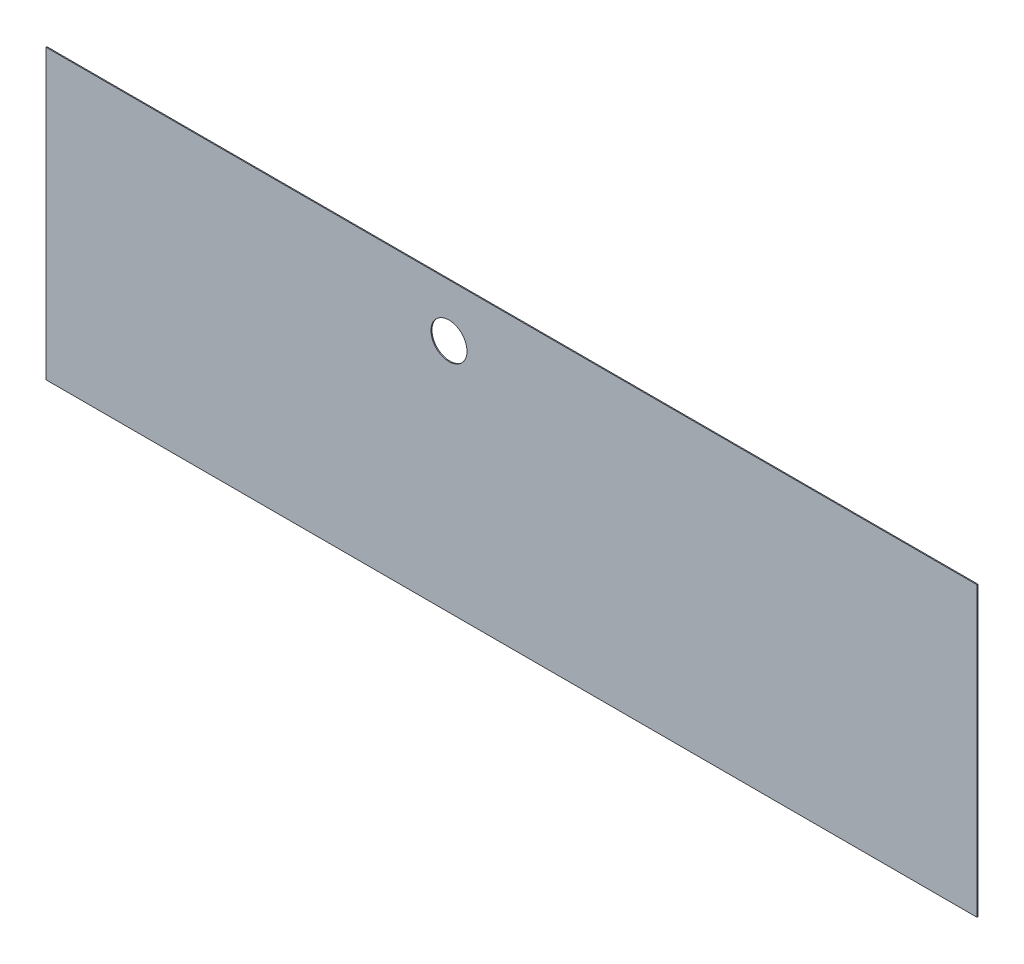
ISO-10303-21;
HEADER;
FILE_DESCRIPTION(('STEP AP214'),'2;1');
FILE_NAME('part.step','',(''),(''),'','','');
FILE_SCHEMA(('AUTOMOTIVE_DESIGN { 1 0 10303 214 1 1 1 1 }'));
ENDSEC;
DATA;
#1=APPLICATION_CONTEXT('core data for automotive mechanical design processes');
#2=APPLICATION_PROTOCOL_DEFINITION('international standard','automotive_design',2000,#1);
#3=PRODUCT_CONTEXT('',#1,'mechanical');
#4=PRODUCT('Part','Part','',(#3));
#5=PRODUCT_RELATED_PRODUCT_CATEGORY('part','',(#4));
#6=PRODUCT_DEFINITION_FORMATION('','',#4);
#7=PRODUCT_DEFINITION_CONTEXT('part definition',#1,'design');
#8=PRODUCT_DEFINITION('design','',#6,#7);
#9=PRODUCT_DEFINITION_SHAPE('','',#8);
#10=(LENGTH_UNIT() NAMED_UNIT(*) SI_UNIT(.MILLI.,.METRE.));
#11=(NAMED_UNIT(*) PLANE_ANGLE_UNIT() SI_UNIT($,.RADIAN.));
#12=(NAMED_UNIT(*) SI_UNIT($,.STERADIAN.) SOLID_ANGLE_UNIT());
#13=UNCERTAINTY_MEASURE_WITH_UNIT(LENGTH_MEASURE(1.E-05),#10,'distance_accuracy_value','');
#14=(GEOMETRIC_REPRESENTATION_CONTEXT(3) GLOBAL_UNCERTAINTY_ASSIGNED_CONTEXT((#13)) GLOBAL_UNIT_ASSIGNED_CONTEXT((#10,
#11,#12)) REPRESENTATION_CONTEXT('',''));
#15=CARTESIAN_POINT('',(0.,0.,0.));
#16=DIRECTION('',(0.,0.,1.));
#17=DIRECTION('',(1.,0.,0.));
#18=AXIS2_PLACEMENT_3D('',#15,#16,#17);
#19=CARTESIAN_POINT('',(-969.75,-300.,2.));
#20=DIRECTION('',(1.,0.,0.));
#21=DIRECTION('',(0.,0.,-1.));
#22=AXIS2_PLACEMENT_3D('',#19,#20,#21);
#23=PLANE('',#22);
#24=DIRECTION('',(0.,-1.,0.));
#25=VECTOR('',#24,1.);
#26=CARTESIAN_POINT('',(-969.75,-300.,0.));
#27=LINE('',#26,#25);
#28=CARTESIAN_POINT('',(-969.75,300.,0.));
#29=VERTEX_POINT('',#28);
#30=CARTESIAN_POINT('',(-969.75,-300.,0.));
#31=VERTEX_POINT('',#30);
#32=EDGE_CURVE('E94',#29,#31,#27,.T.);
#33=ORIENTED_EDGE('',*,*,#32,.T.);
#34=DIRECTION('',(0.,0.,-1.));
#35=VECTOR('',#34,1.);
#36=CARTESIAN_POINT('',(-969.75,-300.,2.));
#37=LINE('',#36,#35);
#38=CARTESIAN_POINT('',(-969.75,-300.,2.));
#39=VERTEX_POINT('',#38);
#40=EDGE_CURVE('E11',#39,#31,#37,.T.);
#41=ORIENTED_EDGE('',*,*,#40,.F.);
#42=DIRECTION('',(0.,-1.,0.));
#43=VECTOR('',#42,1.);
#44=CARTESIAN_POINT('',(-969.75,-300.,2.));
#45=LINE('',#44,#43);
#46=CARTESIAN_POINT('',(-969.75,300.,2.));
#47=VERTEX_POINT('',#46);
#48=EDGE_CURVE('E82',#47,#39,#45,.T.);
#49=ORIENTED_EDGE('',*,*,#48,.F.);
#50=DIRECTION('',(0.,0.,-1.));
#51=VECTOR('',#50,1.);
#52=CARTESIAN_POINT('',(-969.75,300.,2.));
#53=LINE('',#52,#51);
#54=EDGE_CURVE('E90',#47,#29,#53,.T.);
#55=ORIENTED_EDGE('',*,*,#54,.T.);
#56=EDGE_LOOP('',(#33,#41,#49,#55));
#57=FACE_BOUND('',#56,.T.);
#58=ADVANCED_FACE('F31',(#57),#23,.F.);
#59=CARTESIAN_POINT('',(969.75,-300.,2.));
#60=DIRECTION('',(0.,1.,0.));
#61=DIRECTION('',(-1.,0.,0.));
#62=AXIS2_PLACEMENT_3D('',#59,#60,#61);
#63=PLANE('',#62);
#64=DIRECTION('',(1.,0.,0.));
#65=VECTOR('',#64,1.);
#66=CARTESIAN_POINT('',(969.75,-300.,0.));
#67=LINE('',#66,#65);
#68=CARTESIAN_POINT('',(969.75,-300.,0.));
#69=VERTEX_POINT('',#68);
#70=EDGE_CURVE('E86',#31,#69,#67,.T.);
#71=ORIENTED_EDGE('',*,*,#70,.T.);
#72=DIRECTION('',(0.,0.,-1.));
#73=VECTOR('',#72,1.);
#74=CARTESIAN_POINT('',(969.75,-300.,2.));
#75=LINE('',#74,#73);
#76=CARTESIAN_POINT('',(969.75,-300.,2.));
#77=VERTEX_POINT('',#76);
#78=EDGE_CURVE('E39',#77,#69,#75,.T.);
#79=ORIENTED_EDGE('',*,*,#78,.F.);
#80=DIRECTION('',(1.,0.,0.));
#81=VECTOR('',#80,1.);
#82=CARTESIAN_POINT('',(969.75,-300.,2.));
#83=LINE('',#82,#81);
#84=EDGE_CURVE('E77',#39,#77,#83,.T.);
#85=ORIENTED_EDGE('',*,*,#84,.F.);
#86=ORIENTED_EDGE('',*,*,#40,.T.);
#87=EDGE_LOOP('',(#71,#79,#85,#86));
#88=FACE_BOUND('',#87,.T.);
#89=ADVANCED_FACE('F85',(#88),#63,.F.);
#90=CARTESIAN_POINT('',(969.75,-300.,2.));
#91=DIRECTION('',(-1.,0.,0.));
#92=DIRECTION('',(0.,0.,1.));
#93=AXIS2_PLACEMENT_3D('',#90,#91,#92);
#94=PLANE('',#93);
#95=DIRECTION('',(0.,1.,0.));
#96=VECTOR('',#95,1.);
#97=CARTESIAN_POINT('',(969.75,-300.,0.));
#98=LINE('',#97,#96);
#99=CARTESIAN_POINT('',(969.75,300.,0.));
#100=VERTEX_POINT('',#99);
#101=EDGE_CURVE('E64',#69,#100,#98,.T.);
#102=ORIENTED_EDGE('',*,*,#101,.T.);
#103=DIRECTION('',(0.,0.,-1.));
#104=VECTOR('',#103,1.);
#105=CARTESIAN_POINT('',(969.75,300.,2.));
#106=LINE('',#105,#104);
#107=CARTESIAN_POINT('',(969.75,300.,2.));
#108=VERTEX_POINT('',#107);
#109=EDGE_CURVE('E87',#108,#100,#106,.T.);
#110=ORIENTED_EDGE('',*,*,#109,.F.);
#111=DIRECTION('',(0.,1.,0.));
#112=VECTOR('',#111,1.);
#113=CARTESIAN_POINT('',(969.75,-300.,2.));
#114=LINE('',#113,#112);
#115=EDGE_CURVE('E80',#77,#108,#114,.T.);
#116=ORIENTED_EDGE('',*,*,#115,.F.);
#117=ORIENTED_EDGE('',*,*,#78,.T.);
#118=EDGE_LOOP('',(#102,#110,#116,#117));
#119=FACE_BOUND('',#118,.T.);
#120=ADVANCED_FACE('F88',(#119),#94,.F.);
#121=CARTESIAN_POINT('',(969.75,300.,2.));
#122=DIRECTION('',(0.,-1.,0.));
#123=DIRECTION('',(1.,0.,0.));
#124=AXIS2_PLACEMENT_3D('',#121,#122,#123);
#125=PLANE('',#124);
#126=DIRECTION('',(-1.,0.,0.));
#127=VECTOR('',#126,1.);
#128=CARTESIAN_POINT('',(969.75,300.,0.));
#129=LINE('',#128,#127);
#130=EDGE_CURVE('E70',#100,#29,#129,.T.);
#131=ORIENTED_EDGE('',*,*,#130,.T.);
#132=ORIENTED_EDGE('',*,*,#54,.F.);
#133=DIRECTION('',(-1.,0.,0.));
#134=VECTOR('',#133,1.);
#135=CARTESIAN_POINT('',(969.75,300.,2.));
#136=LINE('',#135,#134);
#137=EDGE_CURVE('E47',#108,#47,#136,.T.);
#138=ORIENTED_EDGE('',*,*,#137,.F.);
#139=ORIENTED_EDGE('',*,*,#109,.T.);
#140=EDGE_LOOP('',(#131,#132,#138,#139));
#141=FACE_BOUND('',#140,.T.);
#142=ADVANCED_FACE('F102',(#141),#125,.F.);
#143=CARTESIAN_POINT('',(-969.75,300.,2.));
#144=DIRECTION('',(0.,0.,1.));
#145=DIRECTION('',(1.,0.,0.));
#146=AXIS2_PLACEMENT_3D('',#143,#144,#145);
#147=PLANE('',#146);
#148=CARTESIAN_POINT('',(-130.25,190.,2.));
#149=DIRECTION('',(0.,0.,1.));
#150=DIRECTION('',(1.,0.,0.));
#151=AXIS2_PLACEMENT_3D('',#148,#149,#150);
#152=CIRCLE('',#151,37.5);
#153=CARTESIAN_POINT('',(-92.7500000000001,190.,2.));
#154=VERTEX_POINT('',#153);
#155=EDGE_CURVE('E97',#154,#154,#152,.T.);
#156=ORIENTED_EDGE('',*,*,#155,.F.);
#157=EDGE_LOOP('',(#156));
#158=FACE_BOUND('',#157,.T.);
#159=ORIENTED_EDGE('',*,*,#48,.T.);
#160=ORIENTED_EDGE('',*,*,#84,.T.);
#161=ORIENTED_EDGE('',*,*,#115,.T.);
#162=ORIENTED_EDGE('',*,*,#137,.T.);
#163=EDGE_LOOP('',(#159,#160,#161,#162));
#164=FACE_BOUND('',#163,.T.);
#165=ADVANCED_FACE('F78',(#158,#164),#147,.T.);
#166=CARTESIAN_POINT('',(-969.75,300.,0.));
#167=DIRECTION('',(0.,0.,1.));
#168=DIRECTION('',(1.,0.,0.));
#169=AXIS2_PLACEMENT_3D('',#166,#167,#168);
#170=PLANE('',#169);
#171=CARTESIAN_POINT('',(-130.25,190.,0.));
#172=DIRECTION('',(0.,0.,-1.));
#173=DIRECTION('',(-1.,0.,0.));
#174=AXIS2_PLACEMENT_3D('',#171,#172,#173);
#175=CIRCLE('',#174,37.5);
#176=CARTESIAN_POINT('',(-167.75,190.,0.));
#177=VERTEX_POINT('',#176);
#178=EDGE_CURVE('E110',#177,#177,#175,.T.);
#179=ORIENTED_EDGE('',*,*,#178,.F.);
#180=EDGE_LOOP('',(#179));
#181=FACE_BOUND('',#180,.T.);
#182=ORIENTED_EDGE('',*,*,#32,.F.);
#183=ORIENTED_EDGE('',*,*,#130,.F.);
#184=ORIENTED_EDGE('',*,*,#101,.F.);
#185=ORIENTED_EDGE('',*,*,#70,.F.);
#186=EDGE_LOOP('',(#182,#183,#184,#185));
#187=FACE_BOUND('',#186,.T.);
#188=ADVANCED_FACE('F105',(#181,#187),#170,.F.);
#189=CARTESIAN_POINT('',(-130.25,190.,10.));
#190=DIRECTION('',(0.,0.,-1.));
#191=DIRECTION('',(-1.,0.,0.));
#192=AXIS2_PLACEMENT_3D('',#189,#190,#191);
#193=CYLINDRICAL_SURFACE('',#192,37.5);
#194=ORIENTED_EDGE('',*,*,#155,.T.);
#195=EDGE_LOOP('',(#194));
#196=FACE_BOUND('',#195,.T.);
#197=ORIENTED_EDGE('',*,*,#178,.T.);
#198=EDGE_LOOP('',(#197));
#199=FACE_BOUND('',#198,.T.);
#200=ADVANCED_FACE('F114',(#196,#199),#193,.F.);
#201=CLOSED_SHELL('',(#58,#89,#120,#142,#165,#188,#200));
#202=MANIFOLD_SOLID_BREP('B2',#201);
#203=ADVANCED_BREP_SHAPE_REPRESENTATION('',(#18,#202),#14);
#204=SHAPE_DEFINITION_REPRESENTATION(#9,#203);
ENDSEC;
END-ISO-10303-21;
